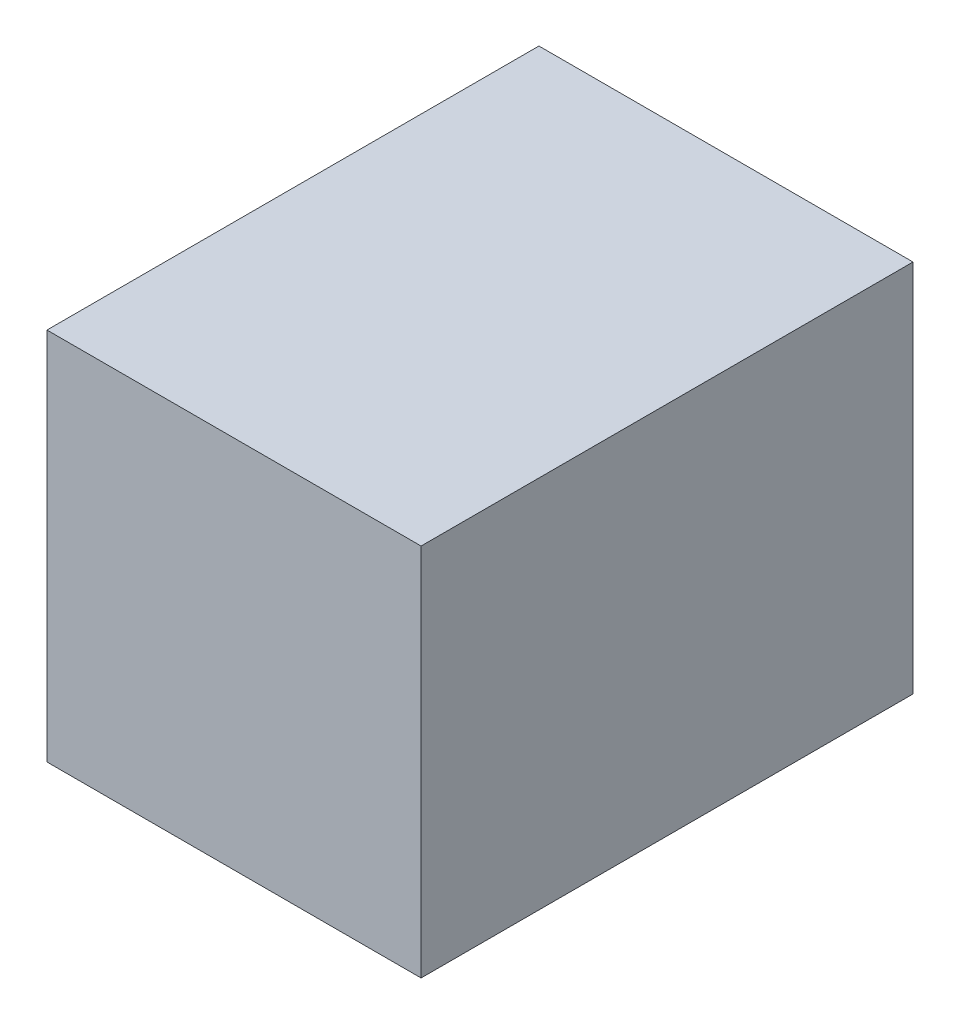
ISO-10303-21;
HEADER;
FILE_DESCRIPTION(('STEP AP214'),'2;1');
FILE_NAME('part.step','',(''),(''),'','','');
FILE_SCHEMA(('AUTOMOTIVE_DESIGN { 1 0 10303 214 1 1 1 1 }'));
ENDSEC;
DATA;
#1=APPLICATION_CONTEXT('core data for automotive mechanical design processes');
#2=APPLICATION_PROTOCOL_DEFINITION('international standard','automotive_design',2000,#1);
#3=PRODUCT_CONTEXT('',#1,'mechanical');
#4=PRODUCT('Part','Part','',(#3));
#5=PRODUCT_RELATED_PRODUCT_CATEGORY('part','',(#4));
#6=PRODUCT_DEFINITION_FORMATION('','',#4);
#7=PRODUCT_DEFINITION_CONTEXT('part definition',#1,'design');
#8=PRODUCT_DEFINITION('design','',#6,#7);
#9=PRODUCT_DEFINITION_SHAPE('','',#8);
#10=(LENGTH_UNIT() NAMED_UNIT(*) SI_UNIT(.MILLI.,.METRE.));
#11=(NAMED_UNIT(*) PLANE_ANGLE_UNIT() SI_UNIT($,.RADIAN.));
#12=(NAMED_UNIT(*) SI_UNIT($,.STERADIAN.) SOLID_ANGLE_UNIT());
#13=UNCERTAINTY_MEASURE_WITH_UNIT(LENGTH_MEASURE(1.E-05),#10,'distance_accuracy_value','');
#14=(GEOMETRIC_REPRESENTATION_CONTEXT(3) GLOBAL_UNCERTAINTY_ASSIGNED_CONTEXT((#13)) GLOBAL_UNIT_ASSIGNED_CONTEXT((#10,
#11,#12)) REPRESENTATION_CONTEXT('',''));
#15=CARTESIAN_POINT('',(0.,0.,0.));
#16=DIRECTION('',(0.,0.,1.));
#17=DIRECTION('',(1.,0.,0.));
#18=AXIS2_PLACEMENT_3D('',#15,#16,#17);
#19=CARTESIAN_POINT('',(5.,10.,-6.575));
#20=DIRECTION('',(-1.,0.,0.));
#21=DIRECTION('',(0.,0.,1.));
#22=AXIS2_PLACEMENT_3D('',#19,#20,#21);
#23=PLANE('',#22);
#24=DIRECTION('',(0.,0.,-1.));
#25=VECTOR('',#24,1.);
#26=CARTESIAN_POINT('',(5.,0.,-6.575));
#27=LINE('',#26,#25);
#28=CARTESIAN_POINT('',(5.,0.,6.575));
#29=VERTEX_POINT('',#28);
#30=CARTESIAN_POINT('',(5.,0.,-6.575));
#31=VERTEX_POINT('',#30);
#32=EDGE_CURVE('E96',#29,#31,#27,.T.);
#33=ORIENTED_EDGE('',*,*,#32,.T.);
#34=DIRECTION('',(0.,-1.,0.));
#35=VECTOR('',#34,1.);
#36=CARTESIAN_POINT('',(5.,10.,-6.575));
#37=LINE('',#36,#35);
#38=CARTESIAN_POINT('',(5.,10.,-6.575));
#39=VERTEX_POINT('',#38);
#40=EDGE_CURVE('E11',#39,#31,#37,.T.);
#41=ORIENTED_EDGE('',*,*,#40,.F.);
#42=DIRECTION('',(0.,0.,-1.));
#43=VECTOR('',#42,1.);
#44=CARTESIAN_POINT('',(5.,10.,-6.575));
#45=LINE('',#44,#43);
#46=CARTESIAN_POINT('',(5.,10.,6.575));
#47=VERTEX_POINT('',#46);
#48=EDGE_CURVE('E84',#47,#39,#45,.T.);
#49=ORIENTED_EDGE('',*,*,#48,.F.);
#50=DIRECTION('',(0.,-1.,0.));
#51=VECTOR('',#50,1.);
#52=CARTESIAN_POINT('',(5.,10.,6.575));
#53=LINE('',#52,#51);
#54=EDGE_CURVE('E92',#47,#29,#53,.T.);
#55=ORIENTED_EDGE('',*,*,#54,.T.);
#56=EDGE_LOOP('',(#33,#41,#49,#55));
#57=FACE_BOUND('',#56,.T.);
#58=ADVANCED_FACE('F33',(#57),#23,.F.);
#59=CARTESIAN_POINT('',(-5.,10.,-6.575));
#60=DIRECTION('',(0.,0.,1.));
#61=DIRECTION('',(1.,0.,0.));
#62=AXIS2_PLACEMENT_3D('',#59,#60,#61);
#63=PLANE('',#62);
#64=DIRECTION('',(-1.,0.,0.));
#65=VECTOR('',#64,1.);
#66=CARTESIAN_POINT('',(-5.,0.,-6.575));
#67=LINE('',#66,#65);
#68=CARTESIAN_POINT('',(-5.,0.,-6.575));
#69=VERTEX_POINT('',#68);
#70=EDGE_CURVE('E88',#31,#69,#67,.T.);
#71=ORIENTED_EDGE('',*,*,#70,.T.);
#72=DIRECTION('',(0.,-1.,0.));
#73=VECTOR('',#72,1.);
#74=CARTESIAN_POINT('',(-5.,10.,-6.575));
#75=LINE('',#74,#73);
#76=CARTESIAN_POINT('',(-5.,10.,-6.575));
#77=VERTEX_POINT('',#76);
#78=EDGE_CURVE('E41',#77,#69,#75,.T.);
#79=ORIENTED_EDGE('',*,*,#78,.F.);
#80=DIRECTION('',(-1.,0.,0.));
#81=VECTOR('',#80,1.);
#82=CARTESIAN_POINT('',(-5.,10.,-6.575));
#83=LINE('',#82,#81);
#84=EDGE_CURVE('E79',#39,#77,#83,.T.);
#85=ORIENTED_EDGE('',*,*,#84,.F.);
#86=ORIENTED_EDGE('',*,*,#40,.T.);
#87=EDGE_LOOP('',(#71,#79,#85,#86));
#88=FACE_BOUND('',#87,.T.);
#89=ADVANCED_FACE('F87',(#88),#63,.F.);
#90=CARTESIAN_POINT('',(-5.,10.,-6.575));
#91=DIRECTION('',(1.,0.,0.));
#92=DIRECTION('',(0.,0.,-1.));
#93=AXIS2_PLACEMENT_3D('',#90,#91,#92);
#94=PLANE('',#93);
#95=DIRECTION('',(0.,0.,1.));
#96=VECTOR('',#95,1.);
#97=CARTESIAN_POINT('',(-5.,0.,-6.575));
#98=LINE('',#97,#96);
#99=CARTESIAN_POINT('',(-5.,0.,6.575));
#100=VERTEX_POINT('',#99);
#101=EDGE_CURVE('E66',#69,#100,#98,.T.);
#102=ORIENTED_EDGE('',*,*,#101,.T.);
#103=DIRECTION('',(0.,-1.,0.));
#104=VECTOR('',#103,1.);
#105=CARTESIAN_POINT('',(-5.,10.,6.575));
#106=LINE('',#105,#104);
#107=CARTESIAN_POINT('',(-5.,10.,6.575));
#108=VERTEX_POINT('',#107);
#109=EDGE_CURVE('E89',#108,#100,#106,.T.);
#110=ORIENTED_EDGE('',*,*,#109,.F.);
#111=DIRECTION('',(0.,0.,1.));
#112=VECTOR('',#111,1.);
#113=CARTESIAN_POINT('',(-5.,10.,-6.575));
#114=LINE('',#113,#112);
#115=EDGE_CURVE('E82',#77,#108,#114,.T.);
#116=ORIENTED_EDGE('',*,*,#115,.F.);
#117=ORIENTED_EDGE('',*,*,#78,.T.);
#118=EDGE_LOOP('',(#102,#110,#116,#117));
#119=FACE_BOUND('',#118,.T.);
#120=ADVANCED_FACE('F90',(#119),#94,.F.);
#121=CARTESIAN_POINT('',(-5.,10.,6.575));
#122=DIRECTION('',(0.,0.,-1.));
#123=DIRECTION('',(-1.,0.,0.));
#124=AXIS2_PLACEMENT_3D('',#121,#122,#123);
#125=PLANE('',#124);
#126=DIRECTION('',(1.,0.,0.));
#127=VECTOR('',#126,1.);
#128=CARTESIAN_POINT('',(-5.,0.,6.575));
#129=LINE('',#128,#127);
#130=EDGE_CURVE('E72',#100,#29,#129,.T.);
#131=ORIENTED_EDGE('',*,*,#130,.T.);
#132=ORIENTED_EDGE('',*,*,#54,.F.);
#133=DIRECTION('',(1.,0.,0.));
#134=VECTOR('',#133,1.);
#135=CARTESIAN_POINT('',(-5.,10.,6.575));
#136=LINE('',#135,#134);
#137=EDGE_CURVE('E49',#108,#47,#136,.T.);
#138=ORIENTED_EDGE('',*,*,#137,.F.);
#139=ORIENTED_EDGE('',*,*,#109,.T.);
#140=EDGE_LOOP('',(#131,#132,#138,#139));
#141=FACE_BOUND('',#140,.T.);
#142=ADVANCED_FACE('F103',(#141),#125,.F.);
#143=CARTESIAN_POINT('',(0.,10.,0.));
#144=DIRECTION('',(0.,1.,0.));
#145=DIRECTION('',(0.,0.,1.));
#146=AXIS2_PLACEMENT_3D('',#143,#144,#145);
#147=PLANE('',#146);
#148=ORIENTED_EDGE('',*,*,#48,.T.);
#149=ORIENTED_EDGE('',*,*,#84,.T.);
#150=ORIENTED_EDGE('',*,*,#115,.T.);
#151=ORIENTED_EDGE('',*,*,#137,.T.);
#152=EDGE_LOOP('',(#148,#149,#150,#151));
#153=FACE_BOUND('',#152,.T.);
#154=ADVANCED_FACE('F80',(#153),#147,.T.);
#155=CARTESIAN_POINT('',(0.,0.,0.));
#156=DIRECTION('',(0.,1.,0.));
#157=DIRECTION('',(0.,0.,1.));
#158=AXIS2_PLACEMENT_3D('',#155,#156,#157);
#159=PLANE('',#158);
#160=ORIENTED_EDGE('',*,*,#32,.F.);
#161=ORIENTED_EDGE('',*,*,#130,.F.);
#162=ORIENTED_EDGE('',*,*,#101,.F.);
#163=ORIENTED_EDGE('',*,*,#70,.F.);
#164=EDGE_LOOP('',(#160,#161,#162,#163));
#165=FACE_BOUND('',#164,.T.);
#166=ADVANCED_FACE('F106',(#165),#159,.F.);
#167=CLOSED_SHELL('',(#58,#89,#120,#142,#154,#166));
#168=MANIFOLD_SOLID_BREP('B2',#167);
#169=ADVANCED_BREP_SHAPE_REPRESENTATION('',(#18,#168),#14);
#170=SHAPE_DEFINITION_REPRESENTATION(#9,#169);
ENDSEC;
END-ISO-10303-21;
